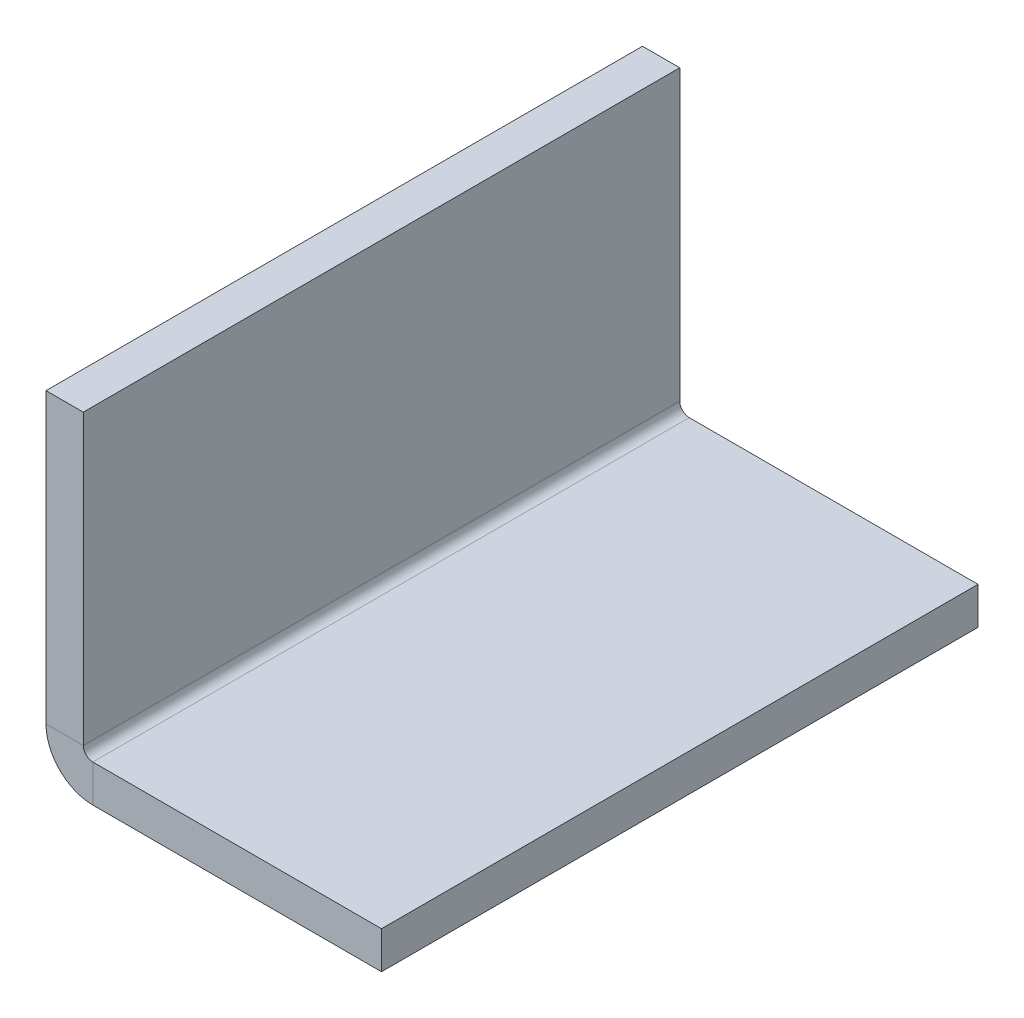
ISO-10303-21;
HEADER;
FILE_DESCRIPTION(('STEP AP214'),'2;1');
FILE_NAME('part.step','',(''),(''),'','','');
FILE_SCHEMA(('AUTOMOTIVE_DESIGN { 1 0 10303 214 1 1 1 1 }'));
ENDSEC;
DATA;
#1=APPLICATION_CONTEXT('core data for automotive mechanical design processes');
#2=APPLICATION_PROTOCOL_DEFINITION('international standard','automotive_design',2000,#1);
#3=PRODUCT_CONTEXT('',#1,'mechanical');
#4=PRODUCT('Part','Part','',(#3));
#5=PRODUCT_RELATED_PRODUCT_CATEGORY('part','',(#4));
#6=PRODUCT_DEFINITION_FORMATION('','',#4);
#7=PRODUCT_DEFINITION_CONTEXT('part definition',#1,'design');
#8=PRODUCT_DEFINITION('design','',#6,#7);
#9=PRODUCT_DEFINITION_SHAPE('','',#8);
#10=(LENGTH_UNIT() NAMED_UNIT(*) SI_UNIT(.MILLI.,.METRE.));
#11=(NAMED_UNIT(*) PLANE_ANGLE_UNIT() SI_UNIT($,.RADIAN.));
#12=(NAMED_UNIT(*) SI_UNIT($,.STERADIAN.) SOLID_ANGLE_UNIT());
#13=UNCERTAINTY_MEASURE_WITH_UNIT(LENGTH_MEASURE(1.E-05),#10,'distance_accuracy_value','');
#14=(GEOMETRIC_REPRESENTATION_CONTEXT(3) GLOBAL_UNCERTAINTY_ASSIGNED_CONTEXT((#13)) GLOBAL_UNIT_ASSIGNED_CONTEXT((#10,
#11,#12)) REPRESENTATION_CONTEXT('',''));
#15=CARTESIAN_POINT('',(0.,0.,0.));
#16=DIRECTION('',(0.,0.,1.));
#17=DIRECTION('',(1.,0.,0.));
#18=AXIS2_PLACEMENT_3D('',#15,#16,#17);
#19=CARTESIAN_POINT('',(0.8128,0.,25.4));
#20=DIRECTION('',(0.,0.,1.));
#21=DIRECTION('',(1.,0.,0.));
#22=AXIS2_PLACEMENT_3D('',#19,#20,#21);
#23=PLANE('',#22);
#24=DIRECTION('',(0.,-1.,0.));
#25=VECTOR('',#24,1.);
#26=CARTESIAN_POINT('',(0.8128,0.,25.4));
#27=LINE('',#26,#25);
#28=CARTESIAN_POINT('',(0.8128,0.,25.4));
#29=VERTEX_POINT('',#28);
#30=CARTESIAN_POINT('',(0.8128,-3.175,25.4));
#31=VERTEX_POINT('',#30);
#32=EDGE_CURVE('E11',#29,#31,#27,.T.);
#33=ORIENTED_EDGE('',*,*,#32,.F.);
#34=CARTESIAN_POINT('',(0.8128,0.812800000000003,25.4));
#35=DIRECTION('',(0.,0.,-1.));
#36=DIRECTION('',(-1.,0.,0.));
#37=AXIS2_PLACEMENT_3D('',#34,#35,#36);
#38=CIRCLE('',#37,0.8128);
#39=CARTESIAN_POINT('',(0.,0.812800000000016,25.4));
#40=VERTEX_POINT('',#39);
#41=EDGE_CURVE('E134',#40,#29,#38,.F.);
#42=ORIENTED_EDGE('',*,*,#41,.F.);
#43=DIRECTION('',(1.,0.,0.));
#44=VECTOR('',#43,1.);
#45=CARTESIAN_POINT('',(-3.175,0.812800000000069,25.4));
#46=LINE('',#45,#44);
#47=CARTESIAN_POINT('',(-3.175,0.812800000000069,25.4));
#48=VERTEX_POINT('',#47);
#49=EDGE_CURVE('E45',#48,#40,#46,.T.);
#50=ORIENTED_EDGE('',*,*,#49,.F.);
#51=CARTESIAN_POINT('',(0.8128,0.812800000000003,25.4));
#52=DIRECTION('',(0.,0.,1.));
#53=DIRECTION('',(1.,0.,0.));
#54=AXIS2_PLACEMENT_3D('',#51,#52,#53);
#55=CIRCLE('',#54,3.9878);
#56=EDGE_CURVE('E127',#48,#31,#55,.T.);
#57=ORIENTED_EDGE('',*,*,#56,.T.);
#58=EDGE_LOOP('',(#33,#42,#50,#57));
#59=FACE_BOUND('',#58,.T.);
#60=ADVANCED_FACE('F37',(#59),#23,.T.);
#61=CARTESIAN_POINT('',(-3.175,0.812800000000069,25.4));
#62=DIRECTION('',(0.,0.,1.));
#63=DIRECTION('',(1.,0.,0.));
#64=AXIS2_PLACEMENT_3D('',#61,#62,#63);
#65=PLANE('',#64);
#66=DIRECTION('',(1.,0.,0.));
#67=VECTOR('',#66,1.);
#68=CARTESIAN_POINT('',(0.,0.,25.4));
#69=LINE('',#68,#67);
#70=CARTESIAN_POINT('',(25.4,0.,25.4));
#71=VERTEX_POINT('',#70);
#72=EDGE_CURVE('E183',#29,#71,#69,.T.);
#73=ORIENTED_EDGE('',*,*,#72,.F.);
#74=ORIENTED_EDGE('',*,*,#32,.T.);
#75=DIRECTION('',(1.,0.,0.));
#76=VECTOR('',#75,1.);
#77=CARTESIAN_POINT('',(0.,-3.175,25.4));
#78=LINE('',#77,#76);
#79=CARTESIAN_POINT('',(25.4,-3.175,25.4));
#80=VERTEX_POINT('',#79);
#81=EDGE_CURVE('E93',#31,#80,#78,.T.);
#82=ORIENTED_EDGE('',*,*,#81,.T.);
#83=DIRECTION('',(0.,-1.,0.));
#84=VECTOR('',#83,1.);
#85=CARTESIAN_POINT('',(25.4,0.,25.4));
#86=LINE('',#85,#84);
#87=EDGE_CURVE('E340',#71,#80,#86,.T.);
#88=ORIENTED_EDGE('',*,*,#87,.F.);
#89=EDGE_LOOP('',(#73,#74,#82,#88));
#90=FACE_BOUND('',#89,.T.);
#91=ADVANCED_FACE('F191',(#90),#65,.T.);
#92=CARTESIAN_POINT('',(0.,0.812800000000016,-25.4));
#93=DIRECTION('',(0.,0.,-1.));
#94=DIRECTION('',(-1.,0.,0.));
#95=AXIS2_PLACEMENT_3D('',#92,#93,#94);
#96=PLANE('',#95);
#97=DIRECTION('',(-1.,0.,0.));
#98=VECTOR('',#97,1.);
#99=CARTESIAN_POINT('',(0.,0.812800000000016,-25.4));
#100=LINE('',#99,#98);
#101=CARTESIAN_POINT('',(0.,0.812800000000016,-25.4));
#102=VERTEX_POINT('',#101);
#103=CARTESIAN_POINT('',(-3.175,0.812800000000069,-25.4));
#104=VERTEX_POINT('',#103);
#105=EDGE_CURVE('E80',#102,#104,#100,.T.);
#106=ORIENTED_EDGE('',*,*,#105,.F.);
#107=CARTESIAN_POINT('',(0.8128,0.812800000000003,-25.4));
#108=DIRECTION('',(0.,0.,-1.));
#109=DIRECTION('',(-1.,0.,0.));
#110=AXIS2_PLACEMENT_3D('',#107,#108,#109);
#111=CIRCLE('',#110,0.8128);
#112=CARTESIAN_POINT('',(0.8128,0.,-25.4));
#113=VERTEX_POINT('',#112);
#114=EDGE_CURVE('E149',#102,#113,#111,.F.);
#115=ORIENTED_EDGE('',*,*,#114,.T.);
#116=DIRECTION('',(0.,1.,0.));
#117=VECTOR('',#116,1.);
#118=CARTESIAN_POINT('',(0.8128,-3.175,-25.4));
#119=LINE('',#118,#117);
#120=CARTESIAN_POINT('',(0.8128,-3.175,-25.4));
#121=VERTEX_POINT('',#120);
#122=EDGE_CURVE('E87',#121,#113,#119,.T.);
#123=ORIENTED_EDGE('',*,*,#122,.F.);
#124=CARTESIAN_POINT('',(0.8128,0.812800000000003,-25.4));
#125=DIRECTION('',(0.,0.,1.));
#126=DIRECTION('',(1.,0.,0.));
#127=AXIS2_PLACEMENT_3D('',#124,#125,#126);
#128=CIRCLE('',#127,3.9878);
#129=EDGE_CURVE('E156',#104,#121,#128,.T.);
#130=ORIENTED_EDGE('',*,*,#129,.F.);
#131=EDGE_LOOP('',(#106,#115,#123,#130));
#132=FACE_BOUND('',#131,.T.);
#133=ADVANCED_FACE('F189',(#132),#96,.T.);
#134=CARTESIAN_POINT('',(0.8128,-3.175,-25.4));
#135=DIRECTION('',(0.,0.,-1.));
#136=DIRECTION('',(-1.,0.,0.));
#137=AXIS2_PLACEMENT_3D('',#134,#135,#136);
#138=PLANE('',#137);
#139=DIRECTION('',(0.,-1.,0.));
#140=VECTOR('',#139,1.);
#141=CARTESIAN_POINT('',(0.,25.4,-25.4));
#142=LINE('',#141,#140);
#143=CARTESIAN_POINT('',(0.,25.4,-25.4));
#144=VERTEX_POINT('',#143);
#145=EDGE_CURVE('E151',#144,#102,#142,.T.);
#146=ORIENTED_EDGE('',*,*,#145,.T.);
#147=ORIENTED_EDGE('',*,*,#105,.T.);
#148=DIRECTION('',(0.,1.,0.));
#149=VECTOR('',#148,1.);
#150=CARTESIAN_POINT('',(-3.175,25.4,-25.4));
#151=LINE('',#150,#149);
#152=CARTESIAN_POINT('',(-3.175,25.4,-25.4));
#153=VERTEX_POINT('',#152);
#154=EDGE_CURVE('E154',#153,#104,#151,.F.);
#155=ORIENTED_EDGE('',*,*,#154,.F.);
#156=DIRECTION('',(1.,0.,0.));
#157=VECTOR('',#156,1.);
#158=CARTESIAN_POINT('',(-3.175,25.4,-25.4));
#159=LINE('',#158,#157);
#160=EDGE_CURVE('E115',#153,#144,#159,.T.);
#161=ORIENTED_EDGE('',*,*,#160,.T.);
#162=EDGE_LOOP('',(#146,#147,#155,#161));
#163=FACE_BOUND('',#162,.T.);
#164=ADVANCED_FACE('F185',(#163),#138,.T.);
#165=CARTESIAN_POINT('',(0.,-3.175,25.4));
#166=DIRECTION('',(0.,1.,0.));
#167=DIRECTION('',(0.,0.,1.));
#168=AXIS2_PLACEMENT_3D('',#165,#166,#167);
#169=PLANE('',#168);
#170=DIRECTION('',(1.,0.,0.));
#171=VECTOR('',#170,1.);
#172=CARTESIAN_POINT('',(0.,-3.175,-25.4));
#173=LINE('',#172,#171);
#174=CARTESIAN_POINT('',(25.4,-3.175,-25.4));
#175=VERTEX_POINT('',#174);
#176=EDGE_CURVE('E140',#121,#175,#173,.T.);
#177=ORIENTED_EDGE('',*,*,#176,.T.);
#178=DIRECTION('',(0.,0.,-1.));
#179=VECTOR('',#178,1.);
#180=CARTESIAN_POINT('',(25.4,-3.175,25.4));
#181=LINE('',#180,#179);
#182=EDGE_CURVE('E170',#80,#175,#181,.T.);
#183=ORIENTED_EDGE('',*,*,#182,.F.);
#184=ORIENTED_EDGE('',*,*,#81,.F.);
#185=DIRECTION('',(0.,0.,-1.));
#186=VECTOR('',#185,1.);
#187=CARTESIAN_POINT('',(0.8128,-3.175,25.4));
#188=LINE('',#187,#186);
#189=EDGE_CURVE('E139',#31,#121,#188,.T.);
#190=ORIENTED_EDGE('',*,*,#189,.T.);
#191=EDGE_LOOP('',(#177,#183,#184,#190));
#192=FACE_BOUND('',#191,.T.);
#193=ADVANCED_FACE('F197',(#192),#169,.F.);
#194=CARTESIAN_POINT('',(25.4,0.,25.4));
#195=DIRECTION('',(1.,0.,0.));
#196=DIRECTION('',(0.,0.,-1.));
#197=AXIS2_PLACEMENT_3D('',#194,#195,#196);
#198=PLANE('',#197);
#199=DIRECTION('',(0.,-1.,0.));
#200=VECTOR('',#199,1.);
#201=CARTESIAN_POINT('',(25.4,0.,-25.4));
#202=LINE('',#201,#200);
#203=CARTESIAN_POINT('',(25.4,0.,-25.4));
#204=VERTEX_POINT('',#203);
#205=EDGE_CURVE('E143',#204,#175,#202,.T.);
#206=ORIENTED_EDGE('',*,*,#205,.F.);
#207=DIRECTION('',(0.,0.,-1.));
#208=VECTOR('',#207,1.);
#209=CARTESIAN_POINT('',(25.4,0.,25.4));
#210=LINE('',#209,#208);
#211=EDGE_CURVE('E168',#71,#204,#210,.T.);
#212=ORIENTED_EDGE('',*,*,#211,.F.);
#213=ORIENTED_EDGE('',*,*,#87,.T.);
#214=ORIENTED_EDGE('',*,*,#182,.T.);
#215=EDGE_LOOP('',(#206,#212,#213,#214));
#216=FACE_BOUND('',#215,.T.);
#217=ADVANCED_FACE('F228',(#216),#198,.T.);
#218=CARTESIAN_POINT('',(0.,0.,25.4));
#219=DIRECTION('',(0.,1.,0.));
#220=DIRECTION('',(0.,0.,1.));
#221=AXIS2_PLACEMENT_3D('',#218,#219,#220);
#222=PLANE('',#221);
#223=DIRECTION('',(1.,0.,0.));
#224=VECTOR('',#223,1.);
#225=CARTESIAN_POINT('',(0.,0.,-25.4));
#226=LINE('',#225,#224);
#227=EDGE_CURVE('E146',#113,#204,#226,.T.);
#228=ORIENTED_EDGE('',*,*,#227,.F.);
#229=DIRECTION('',(0.,0.,-1.));
#230=VECTOR('',#229,1.);
#231=CARTESIAN_POINT('',(0.8128,0.,25.4));
#232=LINE('',#231,#230);
#233=EDGE_CURVE('E165',#29,#113,#232,.T.);
#234=ORIENTED_EDGE('',*,*,#233,.F.);
#235=ORIENTED_EDGE('',*,*,#72,.T.);
#236=ORIENTED_EDGE('',*,*,#211,.T.);
#237=EDGE_LOOP('',(#228,#234,#235,#236));
#238=FACE_BOUND('',#237,.T.);
#239=ADVANCED_FACE('F239',(#238),#222,.T.);
#240=CARTESIAN_POINT('',(0.8128,0.812800000000003,25.4));
#241=DIRECTION('',(0.,0.,-1.));
#242=DIRECTION('',(-1.,0.,0.));
#243=AXIS2_PLACEMENT_3D('',#240,#241,#242);
#244=CYLINDRICAL_SURFACE('',#243,0.8128);
#245=ORIENTED_EDGE('',*,*,#114,.F.);
#246=DIRECTION('',(0.,0.,-1.));
#247=VECTOR('',#246,1.);
#248=CARTESIAN_POINT('',(0.,0.812800000000016,25.4));
#249=LINE('',#248,#247);
#250=EDGE_CURVE('E162',#40,#102,#249,.T.);
#251=ORIENTED_EDGE('',*,*,#250,.F.);
#252=ORIENTED_EDGE('',*,*,#41,.T.);
#253=ORIENTED_EDGE('',*,*,#233,.T.);
#254=EDGE_LOOP('',(#245,#251,#252,#253));
#255=FACE_BOUND('',#254,.T.);
#256=ADVANCED_FACE('F179',(#255),#244,.F.);
#257=CARTESIAN_POINT('',(0.,25.4,25.4));
#258=DIRECTION('',(1.,0.,0.));
#259=DIRECTION('',(0.,0.,-1.));
#260=AXIS2_PLACEMENT_3D('',#257,#258,#259);
#261=PLANE('',#260);
#262=ORIENTED_EDGE('',*,*,#145,.F.);
#263=DIRECTION('',(0.,0.,-1.));
#264=VECTOR('',#263,1.);
#265=CARTESIAN_POINT('',(0.,25.4,25.4));
#266=LINE('',#265,#264);
#267=CARTESIAN_POINT('',(0.,25.4,25.4));
#268=VERTEX_POINT('',#267);
#269=EDGE_CURVE('E117',#268,#144,#266,.T.);
#270=ORIENTED_EDGE('',*,*,#269,.F.);
#271=DIRECTION('',(0.,-1.,0.));
#272=VECTOR('',#271,1.);
#273=CARTESIAN_POINT('',(0.,25.4,25.4));
#274=LINE('',#273,#272);
#275=EDGE_CURVE('E132',#268,#40,#274,.T.);
#276=ORIENTED_EDGE('',*,*,#275,.T.);
#277=ORIENTED_EDGE('',*,*,#250,.T.);
#278=EDGE_LOOP('',(#262,#270,#276,#277));
#279=FACE_BOUND('',#278,.T.);
#280=ADVANCED_FACE('F184',(#279),#261,.T.);
#281=CARTESIAN_POINT('',(-3.175,25.4,25.4));
#282=DIRECTION('',(0.,1.,0.));
#283=DIRECTION('',(0.,0.,1.));
#284=AXIS2_PLACEMENT_3D('',#281,#282,#283);
#285=PLANE('',#284);
#286=ORIENTED_EDGE('',*,*,#160,.F.);
#287=DIRECTION('',(0.,0.,-1.));
#288=VECTOR('',#287,1.);
#289=CARTESIAN_POINT('',(-3.175,25.4,25.4));
#290=LINE('',#289,#288);
#291=CARTESIAN_POINT('',(-3.175,25.4,25.4));
#292=VERTEX_POINT('',#291);
#293=EDGE_CURVE('E109',#292,#153,#290,.T.);
#294=ORIENTED_EDGE('',*,*,#293,.F.);
#295=DIRECTION('',(1.,0.,0.));
#296=VECTOR('',#295,1.);
#297=CARTESIAN_POINT('',(-3.175,25.4,25.4));
#298=LINE('',#297,#296);
#299=EDGE_CURVE('E113',#292,#268,#298,.T.);
#300=ORIENTED_EDGE('',*,*,#299,.T.);
#301=ORIENTED_EDGE('',*,*,#269,.T.);
#302=EDGE_LOOP('',(#286,#294,#300,#301));
#303=FACE_BOUND('',#302,.T.);
#304=ADVANCED_FACE('F111',(#303),#285,.T.);
#305=CARTESIAN_POINT('',(-3.175,25.4,25.4));
#306=DIRECTION('',(1.,0.,0.));
#307=DIRECTION('',(0.,0.,-1.));
#308=AXIS2_PLACEMENT_3D('',#305,#306,#307);
#309=PLANE('',#308);
#310=ORIENTED_EDGE('',*,*,#154,.T.);
#311=DIRECTION('',(0.,0.,-1.));
#312=VECTOR('',#311,1.);
#313=CARTESIAN_POINT('',(-3.175,0.812800000000069,25.4));
#314=LINE('',#313,#312);
#315=EDGE_CURVE('E118',#48,#104,#314,.T.);
#316=ORIENTED_EDGE('',*,*,#315,.F.);
#317=DIRECTION('',(0.,1.,0.));
#318=VECTOR('',#317,1.);
#319=CARTESIAN_POINT('',(-3.175,25.4,25.4));
#320=LINE('',#319,#318);
#321=EDGE_CURVE('E122',#292,#48,#320,.F.);
#322=ORIENTED_EDGE('',*,*,#321,.F.);
#323=ORIENTED_EDGE('',*,*,#293,.T.);
#324=EDGE_LOOP('',(#310,#316,#322,#323));
#325=FACE_BOUND('',#324,.T.);
#326=ADVANCED_FACE('F123',(#325),#309,.F.);
#327=CARTESIAN_POINT('',(0.8128,0.812800000000003,25.4));
#328=DIRECTION('',(0.,0.,-1.));
#329=DIRECTION('',(-1.,0.,0.));
#330=AXIS2_PLACEMENT_3D('',#327,#328,#329);
#331=CYLINDRICAL_SURFACE('',#330,3.9878);
#332=ORIENTED_EDGE('',*,*,#129,.T.);
#333=ORIENTED_EDGE('',*,*,#189,.F.);
#334=ORIENTED_EDGE('',*,*,#56,.F.);
#335=ORIENTED_EDGE('',*,*,#315,.T.);
#336=EDGE_LOOP('',(#332,#333,#334,#335));
#337=FACE_BOUND('',#336,.T.);
#338=ADVANCED_FACE('F187',(#337),#331,.T.);
#339=CARTESIAN_POINT('',(0.8128,0.812800000000003,25.4));
#340=DIRECTION('',(0.,0.,-1.));
#341=DIRECTION('',(-1.,0.,0.));
#342=AXIS2_PLACEMENT_3D('',#339,#340,#341);
#343=PLANE('',#342);
#344=ORIENTED_EDGE('',*,*,#321,.T.);
#345=ORIENTED_EDGE('',*,*,#49,.T.);
#346=ORIENTED_EDGE('',*,*,#275,.F.);
#347=ORIENTED_EDGE('',*,*,#299,.F.);
#348=EDGE_LOOP('',(#344,#345,#346,#347));
#349=FACE_BOUND('',#348,.T.);
#350=ADVANCED_FACE('F130',(#349),#343,.F.);
#351=CARTESIAN_POINT('',(0.8128,0.812800000000003,-25.4));
#352=DIRECTION('',(0.,0.,-1.));
#353=DIRECTION('',(-1.,0.,0.));
#354=AXIS2_PLACEMENT_3D('',#351,#352,#353);
#355=PLANE('',#354);
#356=ORIENTED_EDGE('',*,*,#176,.F.);
#357=ORIENTED_EDGE('',*,*,#122,.T.);
#358=ORIENTED_EDGE('',*,*,#227,.T.);
#359=ORIENTED_EDGE('',*,*,#205,.T.);
#360=EDGE_LOOP('',(#356,#357,#358,#359));
#361=FACE_BOUND('',#360,.T.);
#362=ADVANCED_FACE('F305',(#361),#355,.T.);
#363=CLOSED_SHELL('',(#60,#91,#133,#164,#193,#217,#239,#256,#280,#304,#326,#338,#350,#362));
#364=MANIFOLD_SOLID_BREP('B2',#363);
#365=ADVANCED_BREP_SHAPE_REPRESENTATION('',(#18,#364),#14);
#366=SHAPE_DEFINITION_REPRESENTATION(#9,#365);
ENDSEC;
END-ISO-10303-21;
